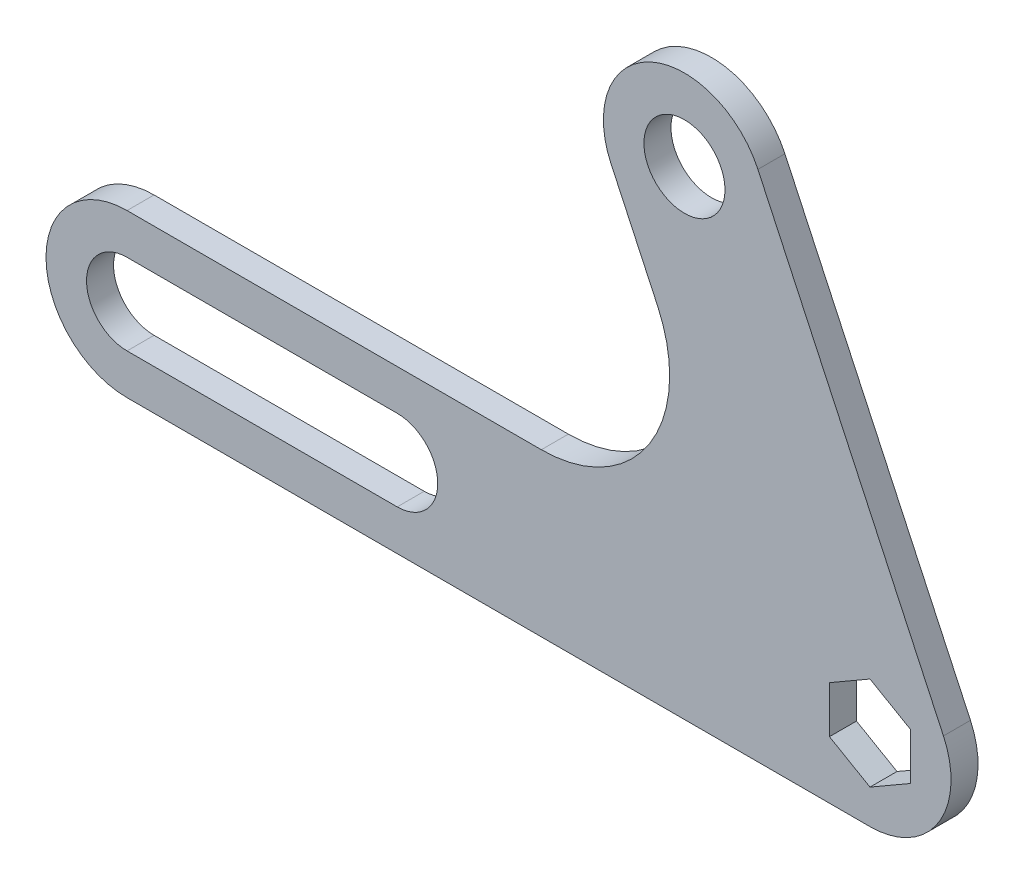
ISO-10303-21;
HEADER;
FILE_DESCRIPTION(('STEP AP214'),'2;1');
FILE_NAME('part.step','',(''),(''),'','','');
FILE_SCHEMA(('AUTOMOTIVE_DESIGN { 1 0 10303 214 1 1 1 1 }'));
ENDSEC;
DATA;
#1=APPLICATION_CONTEXT('core data for automotive mechanical design processes');
#2=APPLICATION_PROTOCOL_DEFINITION('international standard','automotive_design',2000,#1);
#3=PRODUCT_CONTEXT('',#1,'mechanical');
#4=PRODUCT('Part','Part','',(#3));
#5=PRODUCT_RELATED_PRODUCT_CATEGORY('part','',(#4));
#6=PRODUCT_DEFINITION_FORMATION('','',#4);
#7=PRODUCT_DEFINITION_CONTEXT('part definition',#1,'design');
#8=PRODUCT_DEFINITION('design','',#6,#7);
#9=PRODUCT_DEFINITION_SHAPE('','',#8);
#10=(LENGTH_UNIT() NAMED_UNIT(*) SI_UNIT(.MILLI.,.METRE.));
#11=(NAMED_UNIT(*) PLANE_ANGLE_UNIT() SI_UNIT($,.RADIAN.));
#12=(NAMED_UNIT(*) SI_UNIT($,.STERADIAN.) SOLID_ANGLE_UNIT());
#13=UNCERTAINTY_MEASURE_WITH_UNIT(LENGTH_MEASURE(1.E-05),#10,'distance_accuracy_value','');
#14=(GEOMETRIC_REPRESENTATION_CONTEXT(3) GLOBAL_UNCERTAINTY_ASSIGNED_CONTEXT((#13)) GLOBAL_UNIT_ASSIGNED_CONTEXT((#10,
#11,#12)) REPRESENTATION_CONTEXT('',''));
#15=CARTESIAN_POINT('',(0.,0.,0.));
#16=DIRECTION('',(0.,0.,1.));
#17=DIRECTION('',(1.,0.,0.));
#18=AXIS2_PLACEMENT_3D('',#15,#16,#17);
#19=CARTESIAN_POINT('',(0.,12.,4.));
#20=DIRECTION('',(0.,0.,1.));
#21=DIRECTION('',(1.,0.,0.));
#22=AXIS2_PLACEMENT_3D('',#19,#20,#21);
#23=PLANE('',#22);
#24=DIRECTION('',(1.,0.,0.));
#25=VECTOR('',#24,1.);
#26=CARTESIAN_POINT('',(0.,6.,4.));
#27=LINE('',#26,#25);
#28=CARTESIAN_POINT('',(0.,6.,4.));
#29=VERTEX_POINT('',#28);
#30=CARTESIAN_POINT('',(40.,6.00000000000001,4.));
#31=VERTEX_POINT('',#30);
#32=EDGE_CURVE('E245',#29,#31,#27,.T.);
#33=ORIENTED_EDGE('',*,*,#32,.F.);
#34=CARTESIAN_POINT('',(0.,12.,4.));
#35=DIRECTION('',(0.,0.,1.));
#36=DIRECTION('',(1.,0.,0.));
#37=AXIS2_PLACEMENT_3D('',#34,#35,#36);
#38=CIRCLE('',#37,6.);
#39=CARTESIAN_POINT('',(0.,18.,4.));
#40=VERTEX_POINT('',#39);
#41=EDGE_CURVE('E242',#40,#29,#38,.T.);
#42=ORIENTED_EDGE('',*,*,#41,.F.);
#43=DIRECTION('',(-1.,0.,0.));
#44=VECTOR('',#43,1.);
#45=CARTESIAN_POINT('',(0.,18.,4.));
#46=LINE('',#45,#44);
#47=CARTESIAN_POINT('',(40.,18.,4.));
#48=VERTEX_POINT('',#47);
#49=EDGE_CURVE('E253',#48,#40,#46,.T.);
#50=ORIENTED_EDGE('',*,*,#49,.F.);
#51=CARTESIAN_POINT('',(40.,12.,4.));
#52=DIRECTION('',(0.,0.,1.));
#53=DIRECTION('',(1.,0.,0.));
#54=AXIS2_PLACEMENT_3D('',#51,#52,#53);
#55=CIRCLE('',#54,6.);
#56=EDGE_CURVE('E249',#31,#48,#55,.T.);
#57=ORIENTED_EDGE('',*,*,#56,.F.);
#58=EDGE_LOOP('',(#33,#42,#50,#57));
#59=FACE_BOUND('',#58,.T.);
#60=CARTESIAN_POINT('',(0.,12.,4.));
#61=DIRECTION('',(0.,0.,1.));
#62=DIRECTION('',(1.,0.,0.));
#63=AXIS2_PLACEMENT_3D('',#60,#61,#62);
#64=CIRCLE('',#63,12.);
#65=CARTESIAN_POINT('',(0.,24.,4.));
#66=VERTEX_POINT('',#65);
#67=CARTESIAN_POINT('',(0.,0.,4.));
#68=VERTEX_POINT('',#67);
#69=EDGE_CURVE('E285',#66,#68,#64,.T.);
#70=ORIENTED_EDGE('',*,*,#69,.T.);
#71=DIRECTION('',(1.,0.,0.));
#72=VECTOR('',#71,1.);
#73=CARTESIAN_POINT('',(0.,0.,4.));
#74=LINE('',#73,#72);
#75=CARTESIAN_POINT('',(110.,0.,4.));
#76=VERTEX_POINT('',#75);
#77=EDGE_CURVE('E289',#68,#76,#74,.T.);
#78=ORIENTED_EDGE('',*,*,#77,.T.);
#79=CARTESIAN_POINT('',(110.,12.,4.));
#80=DIRECTION('',(0.,0.,1.));
#81=DIRECTION('',(1.,0.,0.));
#82=AXIS2_PLACEMENT_3D('',#79,#80,#81);
#83=CIRCLE('',#82,12.);
#84=CARTESIAN_POINT('',(120.87569344444,17.0714191408884,4.));
#85=VERTEX_POINT('',#84);
#86=EDGE_CURVE('E293',#76,#85,#83,.T.);
#87=ORIENTED_EDGE('',*,*,#86,.T.);
#88=DIRECTION('',(-0.422618261740704,0.906307787036648,0.));
#89=VECTOR('',#88,1.);
#90=CARTESIAN_POINT('',(120.87569344444,17.0714191408884,4.));
#91=LINE('',#90,#89);
#92=CARTESIAN_POINT('',(93.405506431294,75.9814252982705,4.));
#93=VERTEX_POINT('',#92);
#94=EDGE_CURVE('E296',#85,#93,#91,.T.);
#95=ORIENTED_EDGE('',*,*,#94,.T.);
#96=CARTESIAN_POINT('',(82.5298129868542,70.9100061573821,4.));
#97=DIRECTION('',(0.,0.,1.));
#98=DIRECTION('',(1.,0.,0.));
#99=AXIS2_PLACEMENT_3D('',#96,#97,#98);
#100=CIRCLE('',#99,12.);
#101=CARTESIAN_POINT('',(71.6541195424145,65.8385870164937,4.));
#102=VERTEX_POINT('',#101);
#103=EDGE_CURVE('E299',#93,#102,#100,.T.);
#104=ORIENTED_EDGE('',*,*,#103,.T.);
#105=DIRECTION('',(0.422618261740703,-0.906307787036648,0.));
#106=VECTOR('',#105,1.);
#107=CARTESIAN_POINT('',(71.6541195424145,65.8385870164937,4.));
#108=LINE('',#107,#106);
#109=CARTESIAN_POINT('',(78.5595950630538,51.0297469730734,4.));
#110=VERTEX_POINT('',#109);
#111=EDGE_CURVE('E302',#102,#110,#108,.T.);
#112=ORIENTED_EDGE('',*,*,#111,.T.);
#113=CARTESIAN_POINT('',(61.3397471093575,43.,4.));
#114=DIRECTION('',(0.,0.,-1.));
#115=DIRECTION('',(-1.,0.,0.));
#116=AXIS2_PLACEMENT_3D('',#113,#114,#115);
#117=CIRCLE('',#116,19.);
#118=CARTESIAN_POINT('',(61.3397471093575,24.,4.));
#119=VERTEX_POINT('',#118);
#120=EDGE_CURVE('E305',#110,#119,#117,.T.);
#121=ORIENTED_EDGE('',*,*,#120,.T.);
#122=DIRECTION('',(-1.,0.,0.));
#123=VECTOR('',#122,1.);
#124=CARTESIAN_POINT('',(61.3397471093575,24.,4.));
#125=LINE('',#124,#123);
#126=EDGE_CURVE('E308',#119,#66,#125,.T.);
#127=ORIENTED_EDGE('',*,*,#126,.T.);
#128=EDGE_LOOP('',(#70,#78,#87,#95,#104,#112,#121,#127));
#129=FACE_BOUND('',#128,.T.);
#130=CARTESIAN_POINT('',(82.5298129868542,70.9100061573821,4.));
#131=DIRECTION('',(0.,0.,1.));
#132=DIRECTION('',(1.,0.,0.));
#133=AXIS2_PLACEMENT_3D('',#130,#131,#132);
#134=CIRCLE('',#133,6.);
#135=CARTESIAN_POINT('',(88.5298129868543,70.9100061573821,4.));
#136=VERTEX_POINT('',#135);
#137=EDGE_CURVE('E234',#136,#136,#134,.T.);
#138=ORIENTED_EDGE('',*,*,#137,.F.);
#139=EDGE_LOOP('',(#138));
#140=FACE_BOUND('',#139,.T.);
#141=DIRECTION('',(-0.866025403784438,-0.500000000000002,0.));
#142=VECTOR('',#141,1.);
#143=CARTESIAN_POINT('',(110.,18.9282032302755,4.));
#144=LINE('',#143,#142);
#145=CARTESIAN_POINT('',(110.,18.9282032302755,4.));
#146=VERTEX_POINT('',#145);
#147=CARTESIAN_POINT('',(104.,15.4641016151378,4.));
#148=VERTEX_POINT('',#147);
#149=EDGE_CURVE('E174',#146,#148,#144,.T.);
#150=ORIENTED_EDGE('',*,*,#149,.F.);
#151=DIRECTION('',(-0.866025403784439,0.5,0.));
#152=VECTOR('',#151,1.);
#153=CARTESIAN_POINT('',(116.,15.4641016151378,4.));
#154=LINE('',#153,#152);
#155=CARTESIAN_POINT('',(116.,15.4641016151378,4.));
#156=VERTEX_POINT('',#155);
#157=EDGE_CURVE('E165',#156,#146,#154,.T.);
#158=ORIENTED_EDGE('',*,*,#157,.F.);
#159=DIRECTION('',(0.,1.,0.));
#160=VECTOR('',#159,1.);
#161=CARTESIAN_POINT('',(116.,8.53589838486226,4.));
#162=LINE('',#161,#160);
#163=CARTESIAN_POINT('',(116.,8.53589838486226,4.));
#164=VERTEX_POINT('',#163);
#165=EDGE_CURVE('E200',#164,#156,#162,.T.);
#166=ORIENTED_EDGE('',*,*,#165,.F.);
#167=DIRECTION('',(0.866025403784438,0.500000000000001,0.));
#168=VECTOR('',#167,1.);
#169=CARTESIAN_POINT('',(110.,5.07179676972452,4.));
#170=LINE('',#169,#168);
#171=CARTESIAN_POINT('',(110.,5.07179676972452,4.));
#172=VERTEX_POINT('',#171);
#173=EDGE_CURVE('E197',#172,#164,#170,.T.);
#174=ORIENTED_EDGE('',*,*,#173,.F.);
#175=DIRECTION('',(0.866025403784438,-0.5,0.));
#176=VECTOR('',#175,1.);
#177=CARTESIAN_POINT('',(104.,8.53589838486226,4.));
#178=LINE('',#177,#176);
#179=CARTESIAN_POINT('',(104.,8.53589838486226,4.));
#180=VERTEX_POINT('',#179);
#181=EDGE_CURVE('E192',#180,#172,#178,.T.);
#182=ORIENTED_EDGE('',*,*,#181,.F.);
#183=DIRECTION('',(0.,-1.,0.));
#184=VECTOR('',#183,1.);
#185=CARTESIAN_POINT('',(104.,15.4641016151378,4.));
#186=LINE('',#185,#184);
#187=EDGE_CURVE('E188',#148,#180,#186,.T.);
#188=ORIENTED_EDGE('',*,*,#187,.F.);
#189=EDGE_LOOP('',(#150,#158,#166,#174,#182,#188));
#190=FACE_BOUND('',#189,.T.);
#191=ADVANCED_FACE('F39',(#59,#129,#140,#190),#23,.T.);
#192=CARTESIAN_POINT('',(0.,12.,0.));
#193=DIRECTION('',(0.,0.,1.));
#194=DIRECTION('',(1.,0.,0.));
#195=AXIS2_PLACEMENT_3D('',#192,#193,#194);
#196=PLANE('',#195);
#197=CARTESIAN_POINT('',(82.5298129868542,70.9100061573821,0.));
#198=DIRECTION('',(0.,0.,1.));
#199=DIRECTION('',(1.,0.,0.));
#200=AXIS2_PLACEMENT_3D('',#197,#198,#199);
#201=CIRCLE('',#200,6.);
#202=CARTESIAN_POINT('',(88.5298129868543,70.9100061573821,0.));
#203=VERTEX_POINT('',#202);
#204=EDGE_CURVE('E183',#203,#203,#201,.T.);
#205=ORIENTED_EDGE('',*,*,#204,.T.);
#206=EDGE_LOOP('',(#205));
#207=FACE_BOUND('',#206,.T.);
#208=CARTESIAN_POINT('',(0.,12.,0.));
#209=DIRECTION('',(0.,0.,1.));
#210=DIRECTION('',(1.,0.,0.));
#211=AXIS2_PLACEMENT_3D('',#208,#209,#210);
#212=CIRCLE('',#211,6.);
#213=CARTESIAN_POINT('',(0.,18.,0.));
#214=VERTEX_POINT('',#213);
#215=CARTESIAN_POINT('',(0.,6.,0.));
#216=VERTEX_POINT('',#215);
#217=EDGE_CURVE('E238',#214,#216,#212,.T.);
#218=ORIENTED_EDGE('',*,*,#217,.T.);
#219=DIRECTION('',(1.,0.,0.));
#220=VECTOR('',#219,1.);
#221=CARTESIAN_POINT('',(0.,6.,0.));
#222=LINE('',#221,#220);
#223=CARTESIAN_POINT('',(40.,6.00000000000001,0.));
#224=VERTEX_POINT('',#223);
#225=EDGE_CURVE('E260',#216,#224,#222,.T.);
#226=ORIENTED_EDGE('',*,*,#225,.T.);
#227=CARTESIAN_POINT('',(40.,12.,0.));
#228=DIRECTION('',(0.,0.,1.));
#229=DIRECTION('',(1.,0.,0.));
#230=AXIS2_PLACEMENT_3D('',#227,#228,#229);
#231=CIRCLE('',#230,6.);
#232=CARTESIAN_POINT('',(40.,18.,0.));
#233=VERTEX_POINT('',#232);
#234=EDGE_CURVE('E264',#224,#233,#231,.T.);
#235=ORIENTED_EDGE('',*,*,#234,.T.);
#236=DIRECTION('',(-1.,0.,0.));
#237=VECTOR('',#236,1.);
#238=CARTESIAN_POINT('',(0.,18.,0.));
#239=LINE('',#238,#237);
#240=EDGE_CURVE('E246',#233,#214,#239,.T.);
#241=ORIENTED_EDGE('',*,*,#240,.T.);
#242=EDGE_LOOP('',(#218,#226,#235,#241));
#243=FACE_BOUND('',#242,.T.);
#244=CARTESIAN_POINT('',(0.,12.,0.));
#245=DIRECTION('',(0.,0.,1.));
#246=DIRECTION('',(1.,0.,0.));
#247=AXIS2_PLACEMENT_3D('',#244,#245,#246);
#248=CIRCLE('',#247,12.);
#249=CARTESIAN_POINT('',(0.,24.,0.));
#250=VERTEX_POINT('',#249);
#251=CARTESIAN_POINT('',(0.,0.,0.));
#252=VERTEX_POINT('',#251);
#253=EDGE_CURVE('E284',#250,#252,#248,.T.);
#254=ORIENTED_EDGE('',*,*,#253,.F.);
#255=DIRECTION('',(-1.,0.,0.));
#256=VECTOR('',#255,1.);
#257=CARTESIAN_POINT('',(61.3397471093575,24.,0.));
#258=LINE('',#257,#256);
#259=CARTESIAN_POINT('',(61.3397471093575,24.,0.));
#260=VERTEX_POINT('',#259);
#261=EDGE_CURVE('E290',#260,#250,#258,.T.);
#262=ORIENTED_EDGE('',*,*,#261,.F.);
#263=CARTESIAN_POINT('',(61.3397471093575,43.,0.));
#264=DIRECTION('',(0.,0.,-1.));
#265=DIRECTION('',(-1.,0.,0.));
#266=AXIS2_PLACEMENT_3D('',#263,#264,#265);
#267=CIRCLE('',#266,19.);
#268=CARTESIAN_POINT('',(78.5595950630538,51.0297469730734,0.));
#269=VERTEX_POINT('',#268);
#270=EDGE_CURVE('E330',#269,#260,#267,.T.);
#271=ORIENTED_EDGE('',*,*,#270,.F.);
#272=DIRECTION('',(0.422618261740703,-0.906307787036648,0.));
#273=VECTOR('',#272,1.);
#274=CARTESIAN_POINT('',(71.6541195424145,65.8385870164937,0.));
#275=LINE('',#274,#273);
#276=CARTESIAN_POINT('',(71.6541195424145,65.8385870164937,0.));
#277=VERTEX_POINT('',#276);
#278=EDGE_CURVE('E327',#277,#269,#275,.T.);
#279=ORIENTED_EDGE('',*,*,#278,.F.);
#280=CARTESIAN_POINT('',(82.5298129868542,70.9100061573821,0.));
#281=DIRECTION('',(0.,0.,1.));
#282=DIRECTION('',(1.,0.,0.));
#283=AXIS2_PLACEMENT_3D('',#280,#281,#282);
#284=CIRCLE('',#283,12.);
#285=CARTESIAN_POINT('',(93.405506431294,75.9814252982705,0.));
#286=VERTEX_POINT('',#285);
#287=EDGE_CURVE('E324',#286,#277,#284,.T.);
#288=ORIENTED_EDGE('',*,*,#287,.F.);
#289=DIRECTION('',(-0.422618261740704,0.906307787036648,0.));
#290=VECTOR('',#289,1.);
#291=CARTESIAN_POINT('',(120.87569344444,17.0714191408884,0.));
#292=LINE('',#291,#290);
#293=CARTESIAN_POINT('',(120.87569344444,17.0714191408884,0.));
#294=VERTEX_POINT('',#293);
#295=EDGE_CURVE('E321',#294,#286,#292,.T.);
#296=ORIENTED_EDGE('',*,*,#295,.F.);
#297=CARTESIAN_POINT('',(110.,12.,0.));
#298=DIRECTION('',(0.,0.,1.));
#299=DIRECTION('',(1.,0.,0.));
#300=AXIS2_PLACEMENT_3D('',#297,#298,#299);
#301=CIRCLE('',#300,12.);
#302=CARTESIAN_POINT('',(110.,0.,0.));
#303=VERTEX_POINT('',#302);
#304=EDGE_CURVE('E318',#303,#294,#301,.T.);
#305=ORIENTED_EDGE('',*,*,#304,.F.);
#306=DIRECTION('',(1.,0.,0.));
#307=VECTOR('',#306,1.);
#308=CARTESIAN_POINT('',(0.,0.,0.));
#309=LINE('',#308,#307);
#310=EDGE_CURVE('E315',#252,#303,#309,.T.);
#311=ORIENTED_EDGE('',*,*,#310,.F.);
#312=EDGE_LOOP('',(#254,#262,#271,#279,#288,#296,#305,#311));
#313=FACE_BOUND('',#312,.T.);
#314=DIRECTION('',(-0.866025403784439,0.5,0.));
#315=VECTOR('',#314,1.);
#316=CARTESIAN_POINT('',(116.,15.4641016151378,0.));
#317=LINE('',#316,#315);
#318=CARTESIAN_POINT('',(116.,15.4641016151378,0.));
#319=VERTEX_POINT('',#318);
#320=CARTESIAN_POINT('',(110.,18.9282032302755,0.));
#321=VERTEX_POINT('',#320);
#322=EDGE_CURVE('E63',#319,#321,#317,.T.);
#323=ORIENTED_EDGE('',*,*,#322,.T.);
#324=DIRECTION('',(-0.866025403784438,-0.500000000000002,0.));
#325=VECTOR('',#324,1.);
#326=CARTESIAN_POINT('',(110.,18.9282032302755,0.));
#327=LINE('',#326,#325);
#328=CARTESIAN_POINT('',(104.,15.4641016151378,0.));
#329=VERTEX_POINT('',#328);
#330=EDGE_CURVE('E181',#321,#329,#327,.T.);
#331=ORIENTED_EDGE('',*,*,#330,.T.);
#332=DIRECTION('',(0.,-1.,0.));
#333=VECTOR('',#332,1.);
#334=CARTESIAN_POINT('',(104.,15.4641016151378,0.));
#335=LINE('',#334,#333);
#336=CARTESIAN_POINT('',(104.,8.53589838486226,0.));
#337=VERTEX_POINT('',#336);
#338=EDGE_CURVE('E207',#329,#337,#335,.T.);
#339=ORIENTED_EDGE('',*,*,#338,.T.);
#340=DIRECTION('',(0.866025403784438,-0.5,0.));
#341=VECTOR('',#340,1.);
#342=CARTESIAN_POINT('',(104.,8.53589838486226,0.));
#343=LINE('',#342,#341);
#344=CARTESIAN_POINT('',(110.,5.07179676972452,0.));
#345=VERTEX_POINT('',#344);
#346=EDGE_CURVE('E211',#337,#345,#343,.T.);
#347=ORIENTED_EDGE('',*,*,#346,.T.);
#348=DIRECTION('',(0.866025403784438,0.500000000000001,0.));
#349=VECTOR('',#348,1.);
#350=CARTESIAN_POINT('',(110.,5.07179676972452,0.));
#351=LINE('',#350,#349);
#352=CARTESIAN_POINT('',(116.,8.53589838486226,0.));
#353=VERTEX_POINT('',#352);
#354=EDGE_CURVE('E215',#345,#353,#351,.T.);
#355=ORIENTED_EDGE('',*,*,#354,.T.);
#356=DIRECTION('',(0.,1.,0.));
#357=VECTOR('',#356,1.);
#358=CARTESIAN_POINT('',(116.,8.53589838486226,0.));
#359=LINE('',#358,#357);
#360=EDGE_CURVE('E175',#353,#319,#359,.T.);
#361=ORIENTED_EDGE('',*,*,#360,.T.);
#362=EDGE_LOOP('',(#323,#331,#339,#347,#355,#361));
#363=FACE_BOUND('',#362,.T.);
#364=ADVANCED_FACE('F369',(#207,#243,#313,#363),#196,.F.);
#365=CARTESIAN_POINT('',(0.,12.,4.));
#366=DIRECTION('',(0.,0.,-1.));
#367=DIRECTION('',(-1.,0.,0.));
#368=AXIS2_PLACEMENT_3D('',#365,#366,#367);
#369=CYLINDRICAL_SURFACE('',#368,12.);
#370=ORIENTED_EDGE('',*,*,#253,.T.);
#371=DIRECTION('',(0.,0.,-1.));
#372=VECTOR('',#371,1.);
#373=CARTESIAN_POINT('',(0.,0.,4.));
#374=LINE('',#373,#372);
#375=EDGE_CURVE('E11',#68,#252,#374,.T.);
#376=ORIENTED_EDGE('',*,*,#375,.F.);
#377=ORIENTED_EDGE('',*,*,#69,.F.);
#378=DIRECTION('',(0.,0.,-1.));
#379=VECTOR('',#378,1.);
#380=CARTESIAN_POINT('',(0.,24.,4.));
#381=LINE('',#380,#379);
#382=EDGE_CURVE('E311',#66,#250,#381,.T.);
#383=ORIENTED_EDGE('',*,*,#382,.T.);
#384=EDGE_LOOP('',(#370,#376,#377,#383));
#385=FACE_BOUND('',#384,.T.);
#386=ADVANCED_FACE('F41',(#385),#369,.T.);
#387=CARTESIAN_POINT('',(0.,0.,4.));
#388=DIRECTION('',(0.,1.,0.));
#389=DIRECTION('',(0.,0.,1.));
#390=AXIS2_PLACEMENT_3D('',#387,#388,#389);
#391=PLANE('',#390);
#392=ORIENTED_EDGE('',*,*,#310,.T.);
#393=DIRECTION('',(0.,0.,-1.));
#394=VECTOR('',#393,1.);
#395=CARTESIAN_POINT('',(110.,0.,4.));
#396=LINE('',#395,#394);
#397=EDGE_CURVE('E48',#76,#303,#396,.T.);
#398=ORIENTED_EDGE('',*,*,#397,.F.);
#399=ORIENTED_EDGE('',*,*,#77,.F.);
#400=ORIENTED_EDGE('',*,*,#375,.T.);
#401=EDGE_LOOP('',(#392,#398,#399,#400));
#402=FACE_BOUND('',#401,.T.);
#403=ADVANCED_FACE('F387',(#402),#391,.F.);
#404=CARTESIAN_POINT('',(110.,12.,4.));
#405=DIRECTION('',(0.,0.,-1.));
#406=DIRECTION('',(-1.,0.,0.));
#407=AXIS2_PLACEMENT_3D('',#404,#405,#406);
#408=CYLINDRICAL_SURFACE('',#407,12.);
#409=ORIENTED_EDGE('',*,*,#304,.T.);
#410=DIRECTION('',(0.,0.,-1.));
#411=VECTOR('',#410,1.);
#412=CARTESIAN_POINT('',(120.87569344444,17.0714191408884,4.));
#413=LINE('',#412,#411);
#414=EDGE_CURVE('E354',#85,#294,#413,.T.);
#415=ORIENTED_EDGE('',*,*,#414,.F.);
#416=ORIENTED_EDGE('',*,*,#86,.F.);
#417=ORIENTED_EDGE('',*,*,#397,.T.);
#418=EDGE_LOOP('',(#409,#415,#416,#417));
#419=FACE_BOUND('',#418,.T.);
#420=ADVANCED_FACE('F363',(#419),#408,.T.);
#421=CARTESIAN_POINT('',(120.87569344444,17.0714191408884,4.));
#422=DIRECTION('',(-0.906307787036648,-0.422618261740704,0.));
#423=DIRECTION('',(0.422618261740704,-0.906307787036648,0.));
#424=AXIS2_PLACEMENT_3D('',#421,#422,#423);
#425=PLANE('',#424);
#426=ORIENTED_EDGE('',*,*,#295,.T.);
#427=DIRECTION('',(0.,0.,-1.));
#428=VECTOR('',#427,1.);
#429=CARTESIAN_POINT('',(93.405506431294,75.9814252982705,4.));
#430=LINE('',#429,#428);
#431=EDGE_CURVE('E350',#93,#286,#430,.T.);
#432=ORIENTED_EDGE('',*,*,#431,.F.);
#433=ORIENTED_EDGE('',*,*,#94,.F.);
#434=ORIENTED_EDGE('',*,*,#414,.T.);
#435=EDGE_LOOP('',(#426,#432,#433,#434));
#436=FACE_BOUND('',#435,.T.);
#437=ADVANCED_FACE('F375',(#436),#425,.F.);
#438=CARTESIAN_POINT('',(82.5298129868542,70.9100061573821,4.));
#439=DIRECTION('',(0.,0.,-1.));
#440=DIRECTION('',(-1.,0.,0.));
#441=AXIS2_PLACEMENT_3D('',#438,#439,#440);
#442=CYLINDRICAL_SURFACE('',#441,12.);
#443=ORIENTED_EDGE('',*,*,#287,.T.);
#444=DIRECTION('',(0.,0.,-1.));
#445=VECTOR('',#444,1.);
#446=CARTESIAN_POINT('',(71.6541195424145,65.8385870164937,4.));
#447=LINE('',#446,#445);
#448=EDGE_CURVE('E346',#102,#277,#447,.T.);
#449=ORIENTED_EDGE('',*,*,#448,.F.);
#450=ORIENTED_EDGE('',*,*,#103,.F.);
#451=ORIENTED_EDGE('',*,*,#431,.T.);
#452=EDGE_LOOP('',(#443,#449,#450,#451));
#453=FACE_BOUND('',#452,.T.);
#454=ADVANCED_FACE('F379',(#453),#442,.T.);
#455=CARTESIAN_POINT('',(71.6541195424145,65.8385870164937,4.));
#456=DIRECTION('',(0.906307787036648,0.422618261740703,0.));
#457=DIRECTION('',(-0.422618261740703,0.906307787036648,0.));
#458=AXIS2_PLACEMENT_3D('',#455,#456,#457);
#459=PLANE('',#458);
#460=ORIENTED_EDGE('',*,*,#278,.T.);
#461=DIRECTION('',(0.,0.,-1.));
#462=VECTOR('',#461,1.);
#463=CARTESIAN_POINT('',(78.5595950630538,51.0297469730734,4.));
#464=LINE('',#463,#462);
#465=EDGE_CURVE('E342',#110,#269,#464,.T.);
#466=ORIENTED_EDGE('',*,*,#465,.F.);
#467=ORIENTED_EDGE('',*,*,#111,.F.);
#468=ORIENTED_EDGE('',*,*,#448,.T.);
#469=EDGE_LOOP('',(#460,#466,#467,#468));
#470=FACE_BOUND('',#469,.T.);
#471=ADVANCED_FACE('F400',(#470),#459,.F.);
#472=CARTESIAN_POINT('',(61.3397471093575,43.,4.));
#473=DIRECTION('',(0.,0.,-1.));
#474=DIRECTION('',(-1.,0.,0.));
#475=AXIS2_PLACEMENT_3D('',#472,#473,#474);
#476=CYLINDRICAL_SURFACE('',#475,19.);
#477=ORIENTED_EDGE('',*,*,#270,.T.);
#478=DIRECTION('',(0.,0.,-1.));
#479=VECTOR('',#478,1.);
#480=CARTESIAN_POINT('',(61.3397471093575,24.,4.));
#481=LINE('',#480,#479);
#482=EDGE_CURVE('E338',#119,#260,#481,.T.);
#483=ORIENTED_EDGE('',*,*,#482,.F.);
#484=ORIENTED_EDGE('',*,*,#120,.F.);
#485=ORIENTED_EDGE('',*,*,#465,.T.);
#486=EDGE_LOOP('',(#477,#483,#484,#485));
#487=FACE_BOUND('',#486,.T.);
#488=ADVANCED_FACE('F398',(#487),#476,.F.);
#489=CARTESIAN_POINT('',(61.3397471093575,24.,4.));
#490=DIRECTION('',(0.,-1.,0.));
#491=DIRECTION('',(1.,0.,0.));
#492=AXIS2_PLACEMENT_3D('',#489,#490,#491);
#493=PLANE('',#492);
#494=ORIENTED_EDGE('',*,*,#261,.T.);
#495=ORIENTED_EDGE('',*,*,#382,.F.);
#496=ORIENTED_EDGE('',*,*,#126,.F.);
#497=ORIENTED_EDGE('',*,*,#482,.T.);
#498=EDGE_LOOP('',(#494,#495,#496,#497));
#499=FACE_BOUND('',#498,.T.);
#500=ADVANCED_FACE('F393',(#499),#493,.F.);
#501=CARTESIAN_POINT('',(0.,12.,4.));
#502=DIRECTION('',(0.,0.,-1.));
#503=DIRECTION('',(-1.,0.,0.));
#504=AXIS2_PLACEMENT_3D('',#501,#502,#503);
#505=CYLINDRICAL_SURFACE('',#504,6.);
#506=ORIENTED_EDGE('',*,*,#217,.F.);
#507=DIRECTION('',(0.,0.,-1.));
#508=VECTOR('',#507,1.);
#509=CARTESIAN_POINT('',(0.,18.,4.));
#510=LINE('',#509,#508);
#511=EDGE_CURVE('E256',#40,#214,#510,.T.);
#512=ORIENTED_EDGE('',*,*,#511,.F.);
#513=ORIENTED_EDGE('',*,*,#41,.T.);
#514=DIRECTION('',(0.,0.,-1.));
#515=VECTOR('',#514,1.);
#516=CARTESIAN_POINT('',(0.,6.,4.));
#517=LINE('',#516,#515);
#518=EDGE_CURVE('E280',#29,#216,#517,.T.);
#519=ORIENTED_EDGE('',*,*,#518,.T.);
#520=EDGE_LOOP('',(#506,#512,#513,#519));
#521=FACE_BOUND('',#520,.T.);
#522=ADVANCED_FACE('F419',(#521),#505,.F.);
#523=CARTESIAN_POINT('',(0.,6.,4.));
#524=DIRECTION('',(0.,1.,0.));
#525=DIRECTION('',(0.,0.,1.));
#526=AXIS2_PLACEMENT_3D('',#523,#524,#525);
#527=PLANE('',#526);
#528=ORIENTED_EDGE('',*,*,#225,.F.);
#529=ORIENTED_EDGE('',*,*,#518,.F.);
#530=ORIENTED_EDGE('',*,*,#32,.T.);
#531=DIRECTION('',(0.,0.,-1.));
#532=VECTOR('',#531,1.);
#533=CARTESIAN_POINT('',(40.,6.00000000000001,4.));
#534=LINE('',#533,#532);
#535=EDGE_CURVE('E277',#31,#224,#534,.T.);
#536=ORIENTED_EDGE('',*,*,#535,.T.);
#537=EDGE_LOOP('',(#528,#529,#530,#536));
#538=FACE_BOUND('',#537,.T.);
#539=ADVANCED_FACE('F426',(#538),#527,.T.);
#540=CARTESIAN_POINT('',(40.,12.,4.));
#541=DIRECTION('',(0.,0.,-1.));
#542=DIRECTION('',(-1.,0.,0.));
#543=AXIS2_PLACEMENT_3D('',#540,#541,#542);
#544=CYLINDRICAL_SURFACE('',#543,6.);
#545=ORIENTED_EDGE('',*,*,#234,.F.);
#546=ORIENTED_EDGE('',*,*,#535,.F.);
#547=ORIENTED_EDGE('',*,*,#56,.T.);
#548=DIRECTION('',(0.,0.,-1.));
#549=VECTOR('',#548,1.);
#550=CARTESIAN_POINT('',(40.,18.,4.));
#551=LINE('',#550,#549);
#552=EDGE_CURVE('E274',#48,#233,#551,.T.);
#553=ORIENTED_EDGE('',*,*,#552,.T.);
#554=EDGE_LOOP('',(#545,#546,#547,#553));
#555=FACE_BOUND('',#554,.T.);
#556=ADVANCED_FACE('F431',(#555),#544,.F.);
#557=CARTESIAN_POINT('',(0.,18.,4.));
#558=DIRECTION('',(0.,-1.,0.));
#559=DIRECTION('',(0.,0.,-1.));
#560=AXIS2_PLACEMENT_3D('',#557,#558,#559);
#561=PLANE('',#560);
#562=ORIENTED_EDGE('',*,*,#240,.F.);
#563=ORIENTED_EDGE('',*,*,#552,.F.);
#564=ORIENTED_EDGE('',*,*,#49,.T.);
#565=ORIENTED_EDGE('',*,*,#511,.T.);
#566=EDGE_LOOP('',(#562,#563,#564,#565));
#567=FACE_BOUND('',#566,.T.);
#568=ADVANCED_FACE('F439',(#567),#561,.T.);
#569=CARTESIAN_POINT('',(82.5298129868542,70.9100061573821,4.));
#570=DIRECTION('',(0.,0.,-1.));
#571=DIRECTION('',(-1.,0.,0.));
#572=AXIS2_PLACEMENT_3D('',#569,#570,#571);
#573=CYLINDRICAL_SURFACE('',#572,6.);
#574=ORIENTED_EDGE('',*,*,#137,.T.);
#575=EDGE_LOOP('',(#574));
#576=FACE_BOUND('',#575,.T.);
#577=ORIENTED_EDGE('',*,*,#204,.F.);
#578=EDGE_LOOP('',(#577));
#579=FACE_BOUND('',#578,.T.);
#580=ADVANCED_FACE('F450',(#576,#579),#573,.F.);
#581=CARTESIAN_POINT('',(116.,15.4641016151378,4.));
#582=DIRECTION('',(-0.5,-0.866025403784439,0.));
#583=DIRECTION('',(0.866025403784439,-0.5,0.));
#584=AXIS2_PLACEMENT_3D('',#581,#582,#583);
#585=PLANE('',#584);
#586=ORIENTED_EDGE('',*,*,#322,.F.);
#587=DIRECTION('',(0.,0.,-1.));
#588=VECTOR('',#587,1.);
#589=CARTESIAN_POINT('',(116.,15.4641016151378,4.));
#590=LINE('',#589,#588);
#591=EDGE_CURVE('E169',#156,#319,#590,.T.);
#592=ORIENTED_EDGE('',*,*,#591,.F.);
#593=ORIENTED_EDGE('',*,*,#157,.T.);
#594=DIRECTION('',(0.,0.,-1.));
#595=VECTOR('',#594,1.);
#596=CARTESIAN_POINT('',(110.,18.9282032302755,4.));
#597=LINE('',#596,#595);
#598=EDGE_CURVE('E168',#146,#321,#597,.T.);
#599=ORIENTED_EDGE('',*,*,#598,.T.);
#600=EDGE_LOOP('',(#586,#592,#593,#599));
#601=FACE_BOUND('',#600,.T.);
#602=ADVANCED_FACE('F167',(#601),#585,.T.);
#603=CARTESIAN_POINT('',(110.,18.9282032302755,4.));
#604=DIRECTION('',(0.500000000000002,-0.866025403784438,0.));
#605=DIRECTION('',(0.866025403784438,0.500000000000002,0.));
#606=AXIS2_PLACEMENT_3D('',#603,#604,#605);
#607=PLANE('',#606);
#608=ORIENTED_EDGE('',*,*,#330,.F.);
#609=ORIENTED_EDGE('',*,*,#598,.F.);
#610=ORIENTED_EDGE('',*,*,#149,.T.);
#611=DIRECTION('',(0.,0.,-1.));
#612=VECTOR('',#611,1.);
#613=CARTESIAN_POINT('',(104.,15.4641016151378,4.));
#614=LINE('',#613,#612);
#615=EDGE_CURVE('E184',#148,#329,#614,.T.);
#616=ORIENTED_EDGE('',*,*,#615,.T.);
#617=EDGE_LOOP('',(#608,#609,#610,#616));
#618=FACE_BOUND('',#617,.T.);
#619=ADVANCED_FACE('F178',(#618),#607,.T.);
#620=CARTESIAN_POINT('',(104.,15.4641016151378,4.));
#621=DIRECTION('',(1.,0.,0.));
#622=DIRECTION('',(0.,1.,0.));
#623=AXIS2_PLACEMENT_3D('',#620,#621,#622);
#624=PLANE('',#623);
#625=ORIENTED_EDGE('',*,*,#338,.F.);
#626=ORIENTED_EDGE('',*,*,#615,.F.);
#627=ORIENTED_EDGE('',*,*,#187,.T.);
#628=DIRECTION('',(0.,0.,-1.));
#629=VECTOR('',#628,1.);
#630=CARTESIAN_POINT('',(104.,8.53589838486226,4.));
#631=LINE('',#630,#629);
#632=EDGE_CURVE('E229',#180,#337,#631,.T.);
#633=ORIENTED_EDGE('',*,*,#632,.T.);
#634=EDGE_LOOP('',(#625,#626,#627,#633));
#635=FACE_BOUND('',#634,.T.);
#636=ADVANCED_FACE('F460',(#635),#624,.T.);
#637=CARTESIAN_POINT('',(104.,8.53589838486226,4.));
#638=DIRECTION('',(0.5,0.866025403784439,0.));
#639=DIRECTION('',(-0.866025403784439,0.5,0.));
#640=AXIS2_PLACEMENT_3D('',#637,#638,#639);
#641=PLANE('',#640);
#642=ORIENTED_EDGE('',*,*,#346,.F.);
#643=ORIENTED_EDGE('',*,*,#632,.F.);
#644=ORIENTED_EDGE('',*,*,#181,.T.);
#645=DIRECTION('',(0.,0.,-1.));
#646=VECTOR('',#645,1.);
#647=CARTESIAN_POINT('',(110.,5.07179676972452,4.));
#648=LINE('',#647,#646);
#649=EDGE_CURVE('E226',#172,#345,#648,.T.);
#650=ORIENTED_EDGE('',*,*,#649,.T.);
#651=EDGE_LOOP('',(#642,#643,#644,#650));
#652=FACE_BOUND('',#651,.T.);
#653=ADVANCED_FACE('F463',(#652),#641,.T.);
#654=CARTESIAN_POINT('',(110.,5.07179676972452,4.));
#655=DIRECTION('',(-0.500000000000001,0.866025403784438,0.));
#656=DIRECTION('',(-0.866025403784438,-0.500000000000001,0.));
#657=AXIS2_PLACEMENT_3D('',#654,#655,#656);
#658=PLANE('',#657);
#659=ORIENTED_EDGE('',*,*,#354,.F.);
#660=ORIENTED_EDGE('',*,*,#649,.F.);
#661=ORIENTED_EDGE('',*,*,#173,.T.);
#662=DIRECTION('',(0.,0.,-1.));
#663=VECTOR('',#662,1.);
#664=CARTESIAN_POINT('',(116.,8.53589838486226,4.));
#665=LINE('',#664,#663);
#666=EDGE_CURVE('E55',#164,#353,#665,.T.);
#667=ORIENTED_EDGE('',*,*,#666,.T.);
#668=EDGE_LOOP('',(#659,#660,#661,#667));
#669=FACE_BOUND('',#668,.T.);
#670=ADVANCED_FACE('F467',(#669),#658,.T.);
#671=CARTESIAN_POINT('',(116.,8.53589838486226,4.));
#672=DIRECTION('',(-1.,0.,0.));
#673=DIRECTION('',(0.,-1.,0.));
#674=AXIS2_PLACEMENT_3D('',#671,#672,#673);
#675=PLANE('',#674);
#676=ORIENTED_EDGE('',*,*,#360,.F.);
#677=ORIENTED_EDGE('',*,*,#666,.F.);
#678=ORIENTED_EDGE('',*,*,#165,.T.);
#679=ORIENTED_EDGE('',*,*,#591,.T.);
#680=EDGE_LOOP('',(#676,#677,#678,#679));
#681=FACE_BOUND('',#680,.T.);
#682=ADVANCED_FACE('F471',(#681),#675,.T.);
#683=CLOSED_SHELL('',(#191,#364,#386,#403,#420,#437,#454,#471,#488,#500,#522,#539,#556,#568,
#580,#602,#619,#636,#653,#670,#682));
#684=MANIFOLD_SOLID_BREP('B2',#683);
#685=ADVANCED_BREP_SHAPE_REPRESENTATION('',(#18,#684),#14);
#686=SHAPE_DEFINITION_REPRESENTATION(#9,#685);
ENDSEC;
END-ISO-10303-21;
